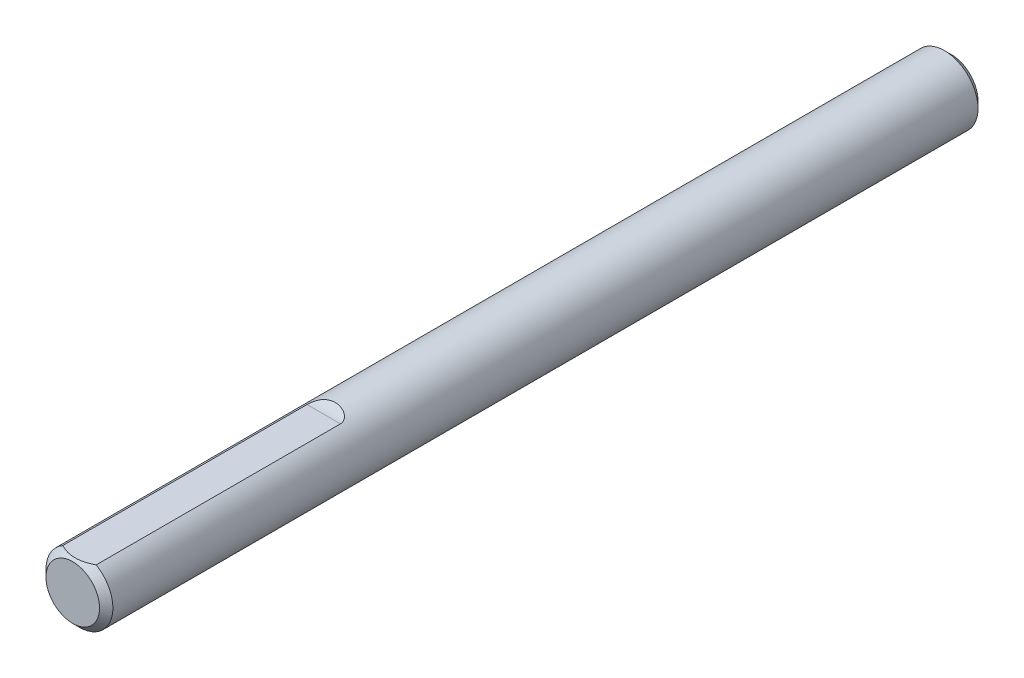
ISO-10303-21;
HEADER;
FILE_DESCRIPTION(('STEP AP214'),'2;1');
FILE_NAME('part.step','',(''),(''),'','','');
FILE_SCHEMA(('AUTOMOTIVE_DESIGN { 1 0 10303 214 1 1 1 1 }'));
ENDSEC;
DATA;
#1=APPLICATION_CONTEXT('core data for automotive mechanical design processes');
#2=APPLICATION_PROTOCOL_DEFINITION('international standard','automotive_design',2000,#1);
#3=PRODUCT_CONTEXT('',#1,'mechanical');
#4=PRODUCT('Part','Part','',(#3));
#5=PRODUCT_RELATED_PRODUCT_CATEGORY('part','',(#4));
#6=PRODUCT_DEFINITION_FORMATION('','',#4);
#7=PRODUCT_DEFINITION_CONTEXT('part definition',#1,'design');
#8=PRODUCT_DEFINITION('design','',#6,#7);
#9=PRODUCT_DEFINITION_SHAPE('','',#8);
#10=(LENGTH_UNIT() NAMED_UNIT(*) SI_UNIT(.MILLI.,.METRE.));
#11=(NAMED_UNIT(*) PLANE_ANGLE_UNIT() SI_UNIT($,.RADIAN.));
#12=(NAMED_UNIT(*) SI_UNIT($,.STERADIAN.) SOLID_ANGLE_UNIT());
#13=UNCERTAINTY_MEASURE_WITH_UNIT(LENGTH_MEASURE(1.E-05),#10,'distance_accuracy_value','');
#14=(GEOMETRIC_REPRESENTATION_CONTEXT(3) GLOBAL_UNCERTAINTY_ASSIGNED_CONTEXT((#13)) GLOBAL_UNIT_ASSIGNED_CONTEXT((#10,
#11,#12)) REPRESENTATION_CONTEXT('',''));
#15=CARTESIAN_POINT('',(0.,0.,0.));
#16=DIRECTION('',(0.,0.,1.));
#17=DIRECTION('',(1.,0.,0.));
#18=AXIS2_PLACEMENT_3D('',#15,#16,#17);
#19=CARTESIAN_POINT('',(0.,0.,41.671875));
#20=DIRECTION('',(0.,0.,-1.));
#21=DIRECTION('',(-1.,0.,0.));
#22=AXIS2_PLACEMENT_3D('',#19,#20,#21);
#23=CYLINDRICAL_SURFACE('',#22,3.175);
#24=CARTESIAN_POINT('',(0.,0.,-41.036875));
#25=DIRECTION('',(0.,0.,1.));
#26=DIRECTION('',(1.,0.,0.));
#27=AXIS2_PLACEMENT_3D('',#24,#25,#26);
#28=CIRCLE('',#27,3.175);
#29=CARTESIAN_POINT('',(3.175,0.,-41.036875));
#30=VERTEX_POINT('',#29);
#31=EDGE_CURVE('E77',#30,#30,#28,.T.);
#32=ORIENTED_EDGE('',*,*,#31,.T.);
#33=EDGE_LOOP('',(#32));
#34=FACE_BOUND('',#33,.T.);
#35=DIRECTION('',(0.,0.,-1.));
#36=VECTOR('',#35,1.);
#37=CARTESIAN_POINT('',(1.5875,2.74963065701559,41.671875));
#38=LINE('',#37,#36);
#39=CARTESIAN_POINT('',(1.5875,2.74963065701559,41.036875));
#40=VERTEX_POINT('',#39);
#41=CARTESIAN_POINT('',(1.5875,2.74963065701559,17.859375));
#42=VERTEX_POINT('',#41);
#43=EDGE_CURVE('E67',#40,#42,#38,.T.);
#44=ORIENTED_EDGE('',*,*,#43,.F.);
#45=CARTESIAN_POINT('',(0.,0.,41.036875));
#46=DIRECTION('',(0.,0.,1.));
#47=DIRECTION('',(1.,0.,0.));
#48=AXIS2_PLACEMENT_3D('',#45,#46,#47);
#49=CIRCLE('',#48,3.175);
#50=CARTESIAN_POINT('',(-1.5875,2.74963065701559,41.036875));
#51=VERTEX_POINT('',#50);
#52=EDGE_CURVE('E74',#40,#51,#49,.F.);
#53=ORIENTED_EDGE('',*,*,#52,.T.);
#54=DIRECTION('',(0.,0.,-1.));
#55=VECTOR('',#54,1.);
#56=CARTESIAN_POINT('',(-1.5875,2.74963065701559,41.671875));
#57=LINE('',#56,#55);
#58=CARTESIAN_POINT('',(-1.5875,2.74963065701559,17.859375));
#59=VERTEX_POINT('',#58);
#60=EDGE_CURVE('E68',#51,#59,#57,.T.);
#61=ORIENTED_EDGE('',*,*,#60,.T.);
#62=CARTESIAN_POINT('',(-1.5875,2.74963065701559,17.859375));
#63=CARTESIAN_POINT('',(-1.58750178569651,2.74962639308054,17.8328103410974));
#64=CARTESIAN_POINT('',(-1.58634408845047,2.7502982998401,17.8062636294735));
#65=CARTESIAN_POINT('',(-1.58174288856939,2.75294846127564,17.7534527001153));
#66=CARTESIAN_POINT('',(-1.5783009477375,2.75492582336941,17.7271883018154));
#67=CARTESIAN_POINT('',(-1.5646830327422,2.76269895716019,17.6496288895136));
#68=CARTESIAN_POINT('',(-1.551213360656,2.77033765524872,17.599053488701));
#69=CARTESIAN_POINT('',(-1.51623611944314,2.78963120482987,17.5017907955976));
#70=CARTESIAN_POINT('',(-1.49474504019164,2.80127781332138,17.4550957654315));
#71=CARTESIAN_POINT('',(-1.44474131527869,2.82739165334368,17.3664389234762));
#72=CARTESIAN_POINT('',(-1.41621577176581,2.84186405576737,17.3244860148859));
#73=CARTESIAN_POINT('',(-1.34578496359668,2.87599535269987,17.2365004623985));
#74=CARTESIAN_POINT('',(-1.30231136721764,2.89606704597912,17.1918900276778));
#75=CARTESIAN_POINT('',(-1.20847653706053,2.93646620658472,17.1108067805518));
#76=CARTESIAN_POINT('',(-1.1581052765641,2.95679400640472,17.0743460217535));
#77=CARTESIAN_POINT('',(-1.03286720377068,3.00328551043621,16.996967765502));
#78=CARTESIAN_POINT('',(-0.955781812150536,3.02886266567658,16.9593019096991));
#79=CARTESIAN_POINT('',(-0.79548196903804,3.07487187219423,16.8958448393491));
#80=CARTESIAN_POINT('',(-0.712258433041084,3.09529609127504,16.8700716523444));
#81=CARTESIAN_POINT('',(-0.52603159674034,3.13281772488301,16.8245695693147));
#82=CARTESIAN_POINT('',(-0.422258149684688,3.14856115941838,16.8068974578339));
#83=CARTESIAN_POINT('',(-0.212299118752605,3.1696535481617,16.7835505465176));
#84=CARTESIAN_POINT('',(-0.106112029661447,3.17499582539124,16.7778834530467));
#85=CARTESIAN_POINT('',(0.0568141619926371,3.17500223515561,16.7778943708167));
#86=CARTESIAN_POINT('',(0.113606806613297,3.1734741903694,16.7795248084965));
#87=CARTESIAN_POINT('',(0.226830805573039,3.16739343445973,16.7861114255848));
#88=CARTESIAN_POINT('',(0.283262270482543,3.16284169858754,16.7910665326707));
#89=CARTESIAN_POINT('',(0.395380241138794,3.15078993002643,16.8044659823858));
#90=CARTESIAN_POINT('',(0.45106694033188,3.14329067893544,16.8129094000437));
#91=CARTESIAN_POINT('',(0.561261613494755,3.12549635664627,16.8335668494568));
#92=CARTESIAN_POINT('',(0.61576994841138,3.11520215505999,16.8457797085614));
#93=CARTESIAN_POINT('',(0.750311277144436,3.08617500628812,16.8815974602435));
#94=CARTESIAN_POINT('',(0.829323016106893,3.06580644990725,16.9078404177358));
#95=CARTESIAN_POINT('',(0.981327530149186,3.02057545528928,16.9714789167066));
#96=CARTESIAN_POINT('',(1.05433043982487,2.99572081927654,17.0088551673377));
#97=CARTESIAN_POINT('',(1.17331622439349,2.95074405838811,17.0851065989237));
#98=CARTESIAN_POINT('',(1.22136504849498,2.93108967748619,17.1210194889384));
#99=CARTESIAN_POINT('',(1.31089254999685,2.89215439117919,17.2004740277838));
#100=CARTESIAN_POINT('',(1.35237935763035,2.87287305001051,17.2440060933762));
#101=CARTESIAN_POINT('',(1.41999064892836,2.83996502567318,17.329891439398));
#102=CARTESIAN_POINT('',(1.44753727736059,2.82595229047228,17.3709713397658));
#103=CARTESIAN_POINT('',(1.49591037559646,2.8006466745864,17.4576218105589));
#104=CARTESIAN_POINT('',(1.51674828916924,2.78934917067927,17.503184558857));
#105=CARTESIAN_POINT('',(1.55125447542514,2.77031446985778,17.5991991326837));
#106=CARTESIAN_POINT('',(1.56470998295963,2.76268364534517,17.6497509055235));
#107=CARTESIAN_POINT('',(1.57831236690268,2.75491927164034,17.7272693426322));
#108=CARTESIAN_POINT('',(1.58175007647685,2.75294432738622,17.7535181526669));
#109=CARTESIAN_POINT('',(1.58634549155474,2.75029748811216,17.8062968202341));
#110=CARTESIAN_POINT('',(1.58750168852218,2.749626455243,17.8328268520651));
#111=CARTESIAN_POINT('',(1.58750000000009,2.74963065701558,17.859375));
#112=B_SPLINE_CURVE_WITH_KNOTS('',3,(#62,#63,#64,#65,#66,#67,#68,#69,#70,#71,#72,#73,#74,#75,
#76,#77,#78,#79,#80,#81,#82,#83,#84,#85,#86,#87,#88,#89,#90,#91,#92,#93,#94,#95,#96,#97,#98,#99,
#100,#101,#102,#103,#104,#105,#106,#107,#108,#109,#110,#111),.UNSPECIFIED.,.F.,.F.,(4,2,2,2,2,2,
2,2,2,2,2,2,2,2,2,2,2,2,2,2,2,2,2,2,4),(0.,0.079625921931934,0.15919745733988,0.316825109384368,
0.474130489908093,0.631726466336666,0.826996500973455,1.02255346220372,1.28967257665474,
1.55719528500118,1.87517413419066,2.19335704132493,2.36371751116882,2.53402306017502,
2.70428347938712,2.87449098490717,3.13071214954222,3.38649191263483,3.57520988866729,
3.76369218297858,3.91728543136876,4.0706152738768,4.22815876167678,4.30768230864862,
4.38725841899962),.UNSPECIFIED.);
#113=EDGE_CURVE('E11',#59,#42,#112,.T.);
#114=ORIENTED_EDGE('',*,*,#113,.T.);
#115=EDGE_LOOP('',(#44,#53,#61,#114));
#116=FACE_BOUND('',#115,.T.);
#117=ADVANCED_FACE('F33',(#34,#116),#23,.T.);
#118=CARTESIAN_POINT('',(0.,0.,41.671875));
#119=DIRECTION('',(0.,0.,-1.));
#120=DIRECTION('',(-1.,0.,0.));
#121=AXIS2_PLACEMENT_3D('',#118,#119,#120);
#122=CONICAL_SURFACE('',#121,2.53999999999999,0.785398163397451);
#123=CARTESIAN_POINT('',(0.,0.,41.671875));
#124=DIRECTION('',(0.,0.,1.));
#125=DIRECTION('',(1.,0.,0.));
#126=AXIS2_PLACEMENT_3D('',#123,#124,#125);
#127=CIRCLE('',#126,2.53999999999999);
#128=CARTESIAN_POINT('',(2.53999999999999,0.,41.671875));
#129=VERTEX_POINT('',#128);
#130=EDGE_CURVE('E72',#129,#129,#127,.T.);
#131=ORIENTED_EDGE('',*,*,#130,.F.);
#132=EDGE_LOOP('',(#131));
#133=FACE_BOUND('',#132,.T.);
#134=ORIENTED_EDGE('',*,*,#52,.F.);
#135=CARTESIAN_POINT('',(-3.22896135223731,2.74963065701559,39.9708067189837));
#136=CARTESIAN_POINT('',(-3.15061649550105,2.74963065701559,40.030441524546));
#137=CARTESIAN_POINT('',(-3.07184009651264,2.74963065701559,40.089518482025));
#138=CARTESIAN_POINT('',(-2.91325130568819,2.74963065701559,40.2063047176183));
#139=CARTESIAN_POINT('',(-2.83343866506295,2.74963065701559,40.2640136575258));
#140=CARTESIAN_POINT('',(-2.67202062852747,2.74963065701559,40.3782225478051));
#141=CARTESIAN_POINT('',(-2.59040613970429,2.74963065701559,40.4347096895372));
#142=CARTESIAN_POINT('',(-2.42580311622164,2.74963065701559,40.5456385143344));
#143=CARTESIAN_POINT('',(-2.34281467809335,2.74963065701559,40.6000803402285));
#144=CARTESIAN_POINT('',(-2.17021447787229,2.74963065701559,40.7096488711656));
#145=CARTESIAN_POINT('',(-2.08050398524193,2.74963065701559,40.7646208353402));
#146=CARTESIAN_POINT('',(-1.89900904678691,2.74963065701559,40.8710219931979));
#147=CARTESIAN_POINT('',(-1.80722487525635,2.74963065701559,40.9224516518349));
#148=CARTESIAN_POINT('',(-1.6215376036893,2.74963065701559,41.0206898050514));
#149=CARTESIAN_POINT('',(-1.52764140922494,2.74963065701559,41.0675112501767));
#150=CARTESIAN_POINT('',(-1.337247065721,2.74963065701559,41.1554758153407));
#151=CARTESIAN_POINT('',(-1.24075014112708,2.74963065701559,41.1966215535942));
#152=CARTESIAN_POINT('',(-1.05364742760748,2.74963065701559,41.2684314372305));
#153=CARTESIAN_POINT('',(-0.963276425588638,2.74963065701559,41.2997010439732));
#154=CARTESIAN_POINT('',(-0.780303735161099,2.74963065701559,41.3549981873504));
#155=CARTESIAN_POINT('',(-0.687701898779457,2.74963065701559,41.3790252421446));
#156=CARTESIAN_POINT('',(-0.502391431282844,2.74963065701559,41.4181632908411));
#157=CARTESIAN_POINT('',(-0.409716445146747,2.74963065701559,41.4334309547489));
#158=CARTESIAN_POINT('',(-0.223306330685257,2.74963065701559,41.4547438420294));
#159=CARTESIAN_POINT('',(-0.129571403437359,2.74963065701559,41.4607907860141));
#160=CARTESIAN_POINT('',(0.0543357559016861,2.74963065701559,41.4631844852485));
#161=CARTESIAN_POINT('',(0.144503242552375,2.74963065701559,41.4599030862278));
#162=CARTESIAN_POINT('',(0.324095543573419,2.74963065701559,41.4446567719638));
#163=CARTESIAN_POINT('',(0.413520286896873,2.74963065701559,41.4326910354814));
#164=CARTESIAN_POINT('',(0.592496066024079,2.74963065701559,41.4005365235361));
#165=CARTESIAN_POINT('',(0.682021177379024,2.74963065701559,41.3802055801752));
#166=CARTESIAN_POINT('',(0.859103373963831,2.74963065701559,41.3324201979539));
#167=CARTESIAN_POINT('',(0.946660601088791,2.74963065701559,41.3049662745012));
#168=CARTESIAN_POINT('',(1.21954622680464,2.74963065701559,41.2090044821897));
#169=CARTESIAN_POINT('',(1.40108594012668,2.74963065701559,41.1296844527363));
#170=CARTESIAN_POINT('',(1.66675889489862,2.74963065701559,40.9974289852257));
#171=CARTESIAN_POINT('',(1.75437488385019,2.74963065701559,40.9510276611238));
#172=CARTESIAN_POINT('',(1.92761951465603,2.74963065701559,40.8546442377677));
#173=CARTESIAN_POINT('',(2.01324850705459,2.74963065701559,40.8046627765756));
#174=CARTESIAN_POINT('',(2.1785518428574,2.74963065701559,40.7043888433061));
#175=CARTESIAN_POINT('',(2.25831097248805,2.74963065701559,40.6542345590396));
#176=CARTESIAN_POINT('',(2.41646118640002,2.74963065701559,40.5518032177625));
#177=CARTESIAN_POINT('',(2.49485216688183,2.74963065701559,40.4995260006805));
#178=CARTESIAN_POINT('',(2.64980987258634,2.74963065701559,40.3936581250554));
#179=CARTESIAN_POINT('',(2.72638621983964,2.74963065701559,40.3400814917738));
#180=CARTESIAN_POINT('',(2.87849044969173,2.74963065701559,40.2315020900169));
#181=CARTESIAN_POINT('',(2.95401861519268,2.74963065701559,40.176499718309));
#182=CARTESIAN_POINT('',(3.0291077096963,2.74963065701559,40.1209139555825));
#183=B_SPLINE_CURVE_WITH_KNOTS('',3,(#135,#136,#137,#138,#139,#140,#141,#142,#143,#144,#145,
#146,#147,#148,#149,#150,#151,#152,#153,#154,#155,#156,#157,#158,#159,#160,#161,#162,#163,#164,
#165,#166,#167,#168,#169,#170,#171,#172,#173,#174,#175,#176,#177,#178,#179,#180,#181,#182),
.UNSPECIFIED.,.F.,.F.,(4,2,2,2,2,2,2,2,2,2,2,2,2,2,2,2,2,2,2,2,2,2,2,4),(0.,0.295383449271208,
0.590839178498785,0.888580871622947,1.18630173399069,1.50187785569756,1.81741247644346,
2.13203338294821,2.44650866534175,2.73314264689635,3.01979569373833,3.30114758261625,
3.58244696402026,3.85269226293494,4.12296312107188,4.39803055604398,4.67307809311872,
5.26557071241313,5.56297998480383,5.86033638333469,6.14295523590882,6.42559543796928,
6.70595195130122,6.9862312647727),.UNSPECIFIED.);
#184=EDGE_CURVE('E65',#40,#51,#183,.F.);
#185=ORIENTED_EDGE('',*,*,#184,.T.);
#186=EDGE_LOOP('',(#134,#185));
#187=FACE_BOUND('',#186,.T.);
#188=ADVANCED_FACE('F76',(#133,#187),#122,.T.);
#189=CARTESIAN_POINT('',(0.,0.,41.671875));
#190=DIRECTION('',(0.,0.,1.));
#191=DIRECTION('',(1.,0.,0.));
#192=AXIS2_PLACEMENT_3D('',#189,#190,#191);
#193=PLANE('',#192);
#194=ORIENTED_EDGE('',*,*,#130,.T.);
#195=EDGE_LOOP('',(#194));
#196=FACE_BOUND('',#195,.T.);
#197=ADVANCED_FACE('F97',(#196),#193,.T.);
#198=CARTESIAN_POINT('',(0.,0.,-41.671875));
#199=DIRECTION('',(0.,0.,1.));
#200=DIRECTION('',(1.,0.,0.));
#201=AXIS2_PLACEMENT_3D('',#198,#199,#200);
#202=PLANE('',#201);
#203=CARTESIAN_POINT('',(0.,0.,-41.671875));
#204=DIRECTION('',(0.,0.,1.));
#205=DIRECTION('',(1.,0.,0.));
#206=AXIS2_PLACEMENT_3D('',#203,#204,#205);
#207=CIRCLE('',#206,2.53999999999998);
#208=CARTESIAN_POINT('',(2.53999999999998,0.,-41.671875));
#209=VERTEX_POINT('',#208);
#210=EDGE_CURVE('E80',#209,#209,#207,.F.);
#211=ORIENTED_EDGE('',*,*,#210,.T.);
#212=EDGE_LOOP('',(#211));
#213=FACE_BOUND('',#212,.T.);
#214=ADVANCED_FACE('F101',(#213),#202,.F.);
#215=CARTESIAN_POINT('',(0.,0.,-41.036875));
#216=DIRECTION('',(0.,0.,1.));
#217=DIRECTION('',(1.,0.,0.));
#218=AXIS2_PLACEMENT_3D('',#215,#216,#217);
#219=CONICAL_SURFACE('',#218,3.175,0.785398163397446);
#220=ORIENTED_EDGE('',*,*,#210,.F.);
#221=EDGE_LOOP('',(#220));
#222=FACE_BOUND('',#221,.T.);
#223=ORIENTED_EDGE('',*,*,#31,.F.);
#224=EDGE_LOOP('',(#223));
#225=FACE_BOUND('',#224,.T.);
#226=ADVANCED_FACE('F99',(#222,#225),#219,.T.);
#227=CARTESIAN_POINT('',(-1.5875,2.74963065701559,41.671875));
#228=DIRECTION('',(0.,1.,0.));
#229=DIRECTION('',(0.,0.,1.));
#230=AXIS2_PLACEMENT_3D('',#227,#228,#229);
#231=PLANE('',#230);
#232=ORIENTED_EDGE('',*,*,#43,.T.);
#233=DIRECTION('',(1.,0.,0.));
#234=VECTOR('',#233,1.);
#235=CARTESIAN_POINT('',(-1.5875,2.74963065701559,17.859375));
#236=LINE('',#235,#234);
#237=EDGE_CURVE('E47',#42,#59,#236,.F.);
#238=ORIENTED_EDGE('',*,*,#237,.T.);
#239=ORIENTED_EDGE('',*,*,#60,.F.);
#240=ORIENTED_EDGE('',*,*,#184,.F.);
#241=EDGE_LOOP('',(#232,#238,#239,#240));
#242=FACE_BOUND('',#241,.T.);
#243=ADVANCED_FACE('F66',(#242),#231,.T.);
#244=CARTESIAN_POINT('',(0.,4.33713065701559,17.859375));
#245=DIRECTION('',(-1.,0.,0.));
#246=DIRECTION('',(0.,0.,1.));
#247=AXIS2_PLACEMENT_3D('',#244,#245,#246);
#248=CYLINDRICAL_SURFACE('',#247,1.5875);
#249=ORIENTED_EDGE('',*,*,#113,.F.);
#250=ORIENTED_EDGE('',*,*,#237,.F.);
#251=EDGE_LOOP('',(#249,#250));
#252=FACE_BOUND('',#251,.T.);
#253=ADVANCED_FACE('F35',(#252),#248,.F.);
#254=CLOSED_SHELL('',(#117,#188,#197,#214,#226,#243,#253));
#255=MANIFOLD_SOLID_BREP('B2',#254);
#256=ADVANCED_BREP_SHAPE_REPRESENTATION('',(#18,#255),#14);
#257=SHAPE_DEFINITION_REPRESENTATION(#9,#256);
ENDSEC;
END-ISO-10303-21;
